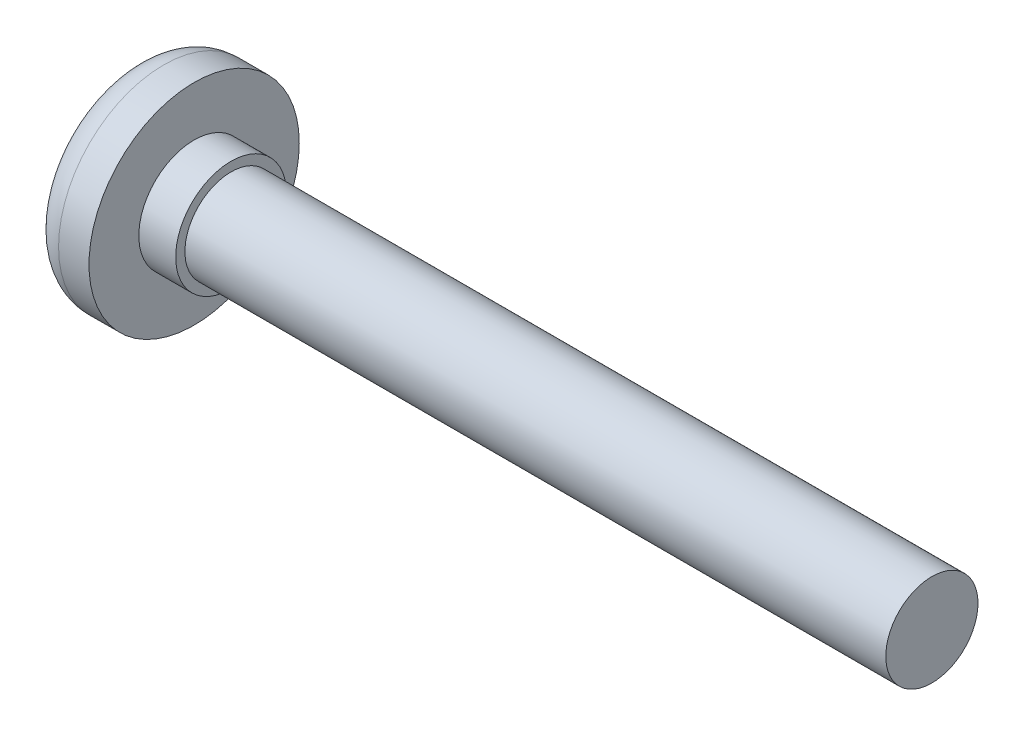
ISO-10303-21;
HEADER;
FILE_DESCRIPTION(('STEP AP214'),'2;1');
FILE_NAME('part.step','',(''),(''),'','','');
FILE_SCHEMA(('AUTOMOTIVE_DESIGN { 1 0 10303 214 1 1 1 1 }'));
ENDSEC;
DATA;
#1=APPLICATION_CONTEXT('core data for automotive mechanical design processes');
#2=APPLICATION_PROTOCOL_DEFINITION('international standard','automotive_design',2000,#1);
#3=PRODUCT_CONTEXT('',#1,'mechanical');
#4=PRODUCT('Part','Part','',(#3));
#5=PRODUCT_RELATED_PRODUCT_CATEGORY('part','',(#4));
#6=PRODUCT_DEFINITION_FORMATION('','',#4);
#7=PRODUCT_DEFINITION_CONTEXT('part definition',#1,'design');
#8=PRODUCT_DEFINITION('design','',#6,#7);
#9=PRODUCT_DEFINITION_SHAPE('','',#8);
#10=(LENGTH_UNIT() NAMED_UNIT(*) SI_UNIT(.MILLI.,.METRE.));
#11=(NAMED_UNIT(*) PLANE_ANGLE_UNIT() SI_UNIT($,.RADIAN.));
#12=(NAMED_UNIT(*) SI_UNIT($,.STERADIAN.) SOLID_ANGLE_UNIT());
#13=UNCERTAINTY_MEASURE_WITH_UNIT(LENGTH_MEASURE(1.E-05),#10,'distance_accuracy_value','');
#14=(GEOMETRIC_REPRESENTATION_CONTEXT(3) GLOBAL_UNCERTAINTY_ASSIGNED_CONTEXT((#13)) GLOBAL_UNIT_ASSIGNED_CONTEXT((#10,
#11,#12)) REPRESENTATION_CONTEXT('',''));
#15=CARTESIAN_POINT('',(0.,0.,0.));
#16=DIRECTION('',(0.,0.,1.));
#17=DIRECTION('',(1.,0.,0.));
#18=AXIS2_PLACEMENT_3D('',#15,#16,#17);
#19=CARTESIAN_POINT('',(22.773389601013,0.,0.));
#20=DIRECTION('',(1.,0.,0.));
#21=DIRECTION('',(0.,0.,-1.));
#22=AXIS2_PLACEMENT_3D('',#19,#20,#21);
#23=CYLINDRICAL_SURFACE('',#22,1.5);
#24=CARTESIAN_POINT('',(-20.,0.,0.));
#25=DIRECTION('',(1.,0.,0.));
#26=DIRECTION('',(0.,0.,-1.));
#27=AXIS2_PLACEMENT_3D('',#24,#25,#26);
#28=CIRCLE('',#27,1.5);
#29=CARTESIAN_POINT('',(-20.,0.,-1.5));
#30=VERTEX_POINT('',#29);
#31=EDGE_CURVE('E243',#30,#30,#28,.T.);
#32=ORIENTED_EDGE('',*,*,#31,.T.);
#33=EDGE_LOOP('',(#32));
#34=FACE_BOUND('',#33,.T.);
#35=CARTESIAN_POINT('',(-19.,0.,0.));
#36=DIRECTION('',(1.,0.,0.));
#37=DIRECTION('',(0.,0.,-1.));
#38=AXIS2_PLACEMENT_3D('',#35,#36,#37);
#39=CIRCLE('',#38,1.5);
#40=CARTESIAN_POINT('',(-19.,0.,-1.5));
#41=VERTEX_POINT('',#40);
#42=EDGE_CURVE('E41',#41,#41,#39,.F.);
#43=ORIENTED_EDGE('',*,*,#42,.T.);
#44=EDGE_LOOP('',(#43));
#45=FACE_BOUND('',#44,.T.);
#46=ADVANCED_FACE('F37',(#34,#45),#23,.T.);
#47=CARTESIAN_POINT('',(-21.65,2.84999999999999,0.));
#48=DIRECTION('',(-1.,0.,0.));
#49=DIRECTION('',(0.,0.,1.));
#50=AXIS2_PLACEMENT_3D('',#47,#48,#49);
#51=PLANE('',#50);
#52=CARTESIAN_POINT('',(-21.65,0.,0.));
#53=DIRECTION('',(-1.,0.,0.));
#54=DIRECTION('',(0.,0.,1.));
#55=AXIS2_PLACEMENT_3D('',#52,#53,#54);
#56=CIRCLE('',#55,2.02499999999999);
#57=CARTESIAN_POINT('',(-21.65,0.,2.02499999999999));
#58=VERTEX_POINT('',#57);
#59=EDGE_CURVE('E141',#58,#58,#56,.T.);
#60=ORIENTED_EDGE('',*,*,#59,.T.);
#61=EDGE_LOOP('',(#60));
#62=FACE_BOUND('',#61,.T.);
#63=CARTESIAN_POINT('',(-21.65,-1.78243556529821,0.));
#64=DIRECTION('',(-1.,0.,0.));
#65=DIRECTION('',(0.,0.,1.));
#66=AXIS2_PLACEMENT_3D('',#63,#64,#65);
#67=CIRCLE('',#66,0.9027181176868);
#68=CARTESIAN_POINT('',(-21.65,-0.976391254172471,0.406438886552242));
#69=VERTEX_POINT('',#68);
#70=CARTESIAN_POINT('',(-21.65,-0.976391254172471,-0.406438886552241));
#71=VERTEX_POINT('',#70);
#72=EDGE_CURVE('E236',#69,#71,#67,.T.);
#73=ORIENTED_EDGE('',*,*,#72,.T.);
#74=CARTESIAN_POINT('',(-21.65,-0.830974793647042,-0.479763520801913));
#75=DIRECTION('',(-1.,0.,0.));
#76=DIRECTION('',(0.,0.,1.));
#77=AXIS2_PLACEMENT_3D('',#74,#75,#76);
#78=CIRCLE('',#77,0.162857142857143);
#79=CARTESIAN_POINT('',(-21.65,-0.840182027926339,-0.642360186870187));
#80=VERTEX_POINT('',#79);
#81=EDGE_CURVE('E188',#71,#80,#78,.F.);
#82=ORIENTED_EDGE('',*,*,#81,.T.);
#83=CARTESIAN_POINT('',(-21.65,-0.891217782649108,-1.54363448015713));
#84=DIRECTION('',(-1.,0.,0.));
#85=DIRECTION('',(0.,0.,1.));
#86=AXIS2_PLACEMENT_3D('',#83,#84,#85);
#87=CIRCLE('',#86,0.9027181176868);
#88=CARTESIAN_POINT('',(-21.65,-0.136209226246133,-1.04879907342243));
#89=VERTEX_POINT('',#88);
#90=EDGE_CURVE('E196',#80,#89,#87,.T.);
#91=ORIENTED_EDGE('',*,*,#90,.T.);
#92=CARTESIAN_POINT('',(-21.65,0.,-0.959527041603826));
#93=DIRECTION('',(-1.,0.,0.));
#94=DIRECTION('',(0.,0.,1.));
#95=AXIS2_PLACEMENT_3D('',#92,#93,#94);
#96=CIRCLE('',#95,0.162857142857143);
#97=CARTESIAN_POINT('',(-21.65,0.136209226246132,-1.04879907342243));
#98=VERTEX_POINT('',#97);
#99=EDGE_CURVE('E190',#89,#98,#96,.F.);
#100=ORIENTED_EDGE('',*,*,#99,.T.);
#101=CARTESIAN_POINT('',(-21.65,0.891217782649106,-1.54363448015713));
#102=DIRECTION('',(-1.,0.,0.));
#103=DIRECTION('',(0.,0.,1.));
#104=AXIS2_PLACEMENT_3D('',#101,#102,#103);
#105=CIRCLE('',#104,0.9027181176868);
#106=CARTESIAN_POINT('',(-21.65,0.840182027926339,-0.642360186870188));
#107=VERTEX_POINT('',#106);
#108=EDGE_CURVE('E194',#98,#107,#105,.T.);
#109=ORIENTED_EDGE('',*,*,#108,.T.);
#110=CARTESIAN_POINT('',(-21.65,0.830974793647042,-0.479763520801914));
#111=DIRECTION('',(-1.,0.,0.));
#112=DIRECTION('',(0.,0.,1.));
#113=AXIS2_PLACEMENT_3D('',#110,#111,#112);
#114=CIRCLE('',#113,0.162857142857143);
#115=CARTESIAN_POINT('',(-21.65,0.976391254172471,-0.406438886552242));
#116=VERTEX_POINT('',#115);
#117=EDGE_CURVE('E46',#107,#116,#114,.F.);
#118=ORIENTED_EDGE('',*,*,#117,.T.);
#119=CARTESIAN_POINT('',(-21.65,1.78243556529821,0.));
#120=DIRECTION('',(-1.,0.,0.));
#121=DIRECTION('',(0.,0.,1.));
#122=AXIS2_PLACEMENT_3D('',#119,#120,#121);
#123=CIRCLE('',#122,0.9027181176868);
#124=CARTESIAN_POINT('',(-21.65,0.976391254172471,0.406438886552242));
#125=VERTEX_POINT('',#124);
#126=EDGE_CURVE('E128',#116,#125,#123,.T.);
#127=ORIENTED_EDGE('',*,*,#126,.T.);
#128=CARTESIAN_POINT('',(-21.65,0.830974793647042,0.479763520801913));
#129=DIRECTION('',(-1.,0.,0.));
#130=DIRECTION('',(0.,0.,1.));
#131=AXIS2_PLACEMENT_3D('',#128,#129,#130);
#132=CIRCLE('',#131,0.162857142857143);
#133=CARTESIAN_POINT('',(-21.65,0.840182027926339,0.642360186870188));
#134=VERTEX_POINT('',#133);
#135=EDGE_CURVE('E12',#125,#134,#132,.F.);
#136=ORIENTED_EDGE('',*,*,#135,.T.);
#137=CARTESIAN_POINT('',(-21.65,0.891217782649109,1.54363448015713));
#138=DIRECTION('',(-1.,0.,0.));
#139=DIRECTION('',(0.,0.,1.));
#140=AXIS2_PLACEMENT_3D('',#137,#138,#139);
#141=CIRCLE('',#140,0.902718117686801);
#142=CARTESIAN_POINT('',(-21.65,0.136209226246133,1.04879907342243));
#143=VERTEX_POINT('',#142);
#144=EDGE_CURVE('E127',#134,#143,#141,.T.);
#145=ORIENTED_EDGE('',*,*,#144,.T.);
#146=CARTESIAN_POINT('',(-21.65,0.,0.959527041603827));
#147=DIRECTION('',(-1.,0.,0.));
#148=DIRECTION('',(0.,0.,1.));
#149=AXIS2_PLACEMENT_3D('',#146,#147,#148);
#150=CIRCLE('',#149,0.162857142857143);
#151=CARTESIAN_POINT('',(-21.65,-0.136209226246132,1.04879907342243));
#152=VERTEX_POINT('',#151);
#153=EDGE_CURVE('E184',#143,#152,#150,.F.);
#154=ORIENTED_EDGE('',*,*,#153,.T.);
#155=CARTESIAN_POINT('',(-21.65,-0.891217782649106,1.54363448015713));
#156=DIRECTION('',(-1.,0.,0.));
#157=DIRECTION('',(0.,0.,1.));
#158=AXIS2_PLACEMENT_3D('',#155,#156,#157);
#159=CIRCLE('',#158,0.9027181176868);
#160=CARTESIAN_POINT('',(-21.65,-0.840182027926338,0.642360186870188));
#161=VERTEX_POINT('',#160);
#162=EDGE_CURVE('E137',#152,#161,#159,.T.);
#163=ORIENTED_EDGE('',*,*,#162,.T.);
#164=CARTESIAN_POINT('',(-21.65,-0.830974793647042,0.479763520801914));
#165=DIRECTION('',(-1.,0.,0.));
#166=DIRECTION('',(0.,0.,1.));
#167=AXIS2_PLACEMENT_3D('',#164,#165,#166);
#168=CIRCLE('',#167,0.162857142857143);
#169=EDGE_CURVE('E186',#161,#69,#168,.F.);
#170=ORIENTED_EDGE('',*,*,#169,.T.);
#171=EDGE_LOOP('',(#73,#82,#91,#100,#109,#118,#127,#136,#145,#154,#163,#170));
#172=FACE_BOUND('',#171,.T.);
#173=ADVANCED_FACE('F126',(#62,#172),#51,.T.);
#174=CARTESIAN_POINT('',(-20.,1.5,0.));
#175=DIRECTION('',(1.,0.,0.));
#176=DIRECTION('',(0.,0.,-1.));
#177=AXIS2_PLACEMENT_3D('',#174,#175,#176);
#178=PLANE('',#177);
#179=CARTESIAN_POINT('',(-20.,0.,0.));
#180=DIRECTION('',(1.,0.,0.));
#181=DIRECTION('',(0.,0.,-1.));
#182=AXIS2_PLACEMENT_3D('',#179,#180,#181);
#183=CIRCLE('',#182,2.84999999999999);
#184=CARTESIAN_POINT('',(-20.,0.,-2.84999999999999));
#185=VERTEX_POINT('',#184);
#186=EDGE_CURVE('E233',#185,#185,#183,.T.);
#187=ORIENTED_EDGE('',*,*,#186,.T.);
#188=EDGE_LOOP('',(#187));
#189=FACE_BOUND('',#188,.T.);
#190=ORIENTED_EDGE('',*,*,#31,.F.);
#191=EDGE_LOOP('',(#190));
#192=FACE_BOUND('',#191,.T.);
#193=ADVANCED_FACE('F272',(#189,#192),#178,.T.);
#194=CARTESIAN_POINT('',(22.773389601013,0.,0.));
#195=DIRECTION('',(1.,0.,0.));
#196=DIRECTION('',(0.,0.,-1.));
#197=AXIS2_PLACEMENT_3D('',#194,#195,#196);
#198=CYLINDRICAL_SURFACE('',#197,2.84999999999999);
#199=CARTESIAN_POINT('',(-20.825,0.,0.));
#200=DIRECTION('',(-1.,0.,0.));
#201=DIRECTION('',(0.,0.,1.));
#202=AXIS2_PLACEMENT_3D('',#199,#200,#201);
#203=CIRCLE('',#202,2.84999999999999);
#204=CARTESIAN_POINT('',(-20.825,0.,2.84999999999999));
#205=VERTEX_POINT('',#204);
#206=EDGE_CURVE('E146',#205,#205,#203,.F.);
#207=ORIENTED_EDGE('',*,*,#206,.T.);
#208=EDGE_LOOP('',(#207));
#209=FACE_BOUND('',#208,.T.);
#210=ORIENTED_EDGE('',*,*,#186,.F.);
#211=EDGE_LOOP('',(#210));
#212=FACE_BOUND('',#211,.T.);
#213=ADVANCED_FACE('F248',(#209,#212),#198,.T.);
#214=CARTESIAN_POINT('',(-20.65,0.891217782649106,-1.54363448015713));
#215=DIRECTION('',(-1.,0.,0.));
#216=DIRECTION('',(0.,0.,1.));
#217=AXIS2_PLACEMENT_3D('',#214,#215,#216);
#218=CYLINDRICAL_SURFACE('',#217,0.9027181176868);
#219=ORIENTED_EDGE('',*,*,#108,.F.);
#220=DIRECTION('',(-1.,0.,0.));
#221=VECTOR('',#220,1.);
#222=CARTESIAN_POINT('',(-20.65,0.136209226246132,-1.04879907342243));
#223=LINE('',#222,#221);
#224=CARTESIAN_POINT('',(-20.65,0.136209226246132,-1.04879907342243));
#225=VERTEX_POINT('',#224);
#226=EDGE_CURVE('E178',#98,#225,#223,.F.);
#227=ORIENTED_EDGE('',*,*,#226,.T.);
#228=CARTESIAN_POINT('',(-20.65,0.891217782649106,-1.54363448015713));
#229=DIRECTION('',(-1.,0.,0.));
#230=DIRECTION('',(0.,0.,1.));
#231=AXIS2_PLACEMENT_3D('',#228,#229,#230);
#232=CIRCLE('',#231,0.9027181176868);
#233=CARTESIAN_POINT('',(-20.65,0.840182027926339,-0.642360186870188));
#234=VERTEX_POINT('',#233);
#235=EDGE_CURVE('E215',#225,#234,#232,.T.);
#236=ORIENTED_EDGE('',*,*,#235,.T.);
#237=DIRECTION('',(-1.,0.,0.));
#238=VECTOR('',#237,1.);
#239=CARTESIAN_POINT('',(-20.65,0.840182027926339,-0.642360186870188));
#240=LINE('',#239,#238);
#241=EDGE_CURVE('E175',#234,#107,#240,.T.);
#242=ORIENTED_EDGE('',*,*,#241,.T.);
#243=EDGE_LOOP('',(#219,#227,#236,#242));
#244=FACE_BOUND('',#243,.T.);
#245=ADVANCED_FACE('F201',(#244),#218,.T.);
#246=CARTESIAN_POINT('',(-20.65,1.78243556529821,0.));
#247=DIRECTION('',(-1.,0.,0.));
#248=DIRECTION('',(0.,0.,1.));
#249=AXIS2_PLACEMENT_3D('',#246,#247,#248);
#250=CYLINDRICAL_SURFACE('',#249,0.9027181176868);
#251=ORIENTED_EDGE('',*,*,#126,.F.);
#252=DIRECTION('',(-1.,0.,0.));
#253=VECTOR('',#252,1.);
#254=CARTESIAN_POINT('',(-20.65,0.976391254172471,-0.406438886552242));
#255=LINE('',#254,#253);
#256=CARTESIAN_POINT('',(-20.65,0.976391254172471,-0.406438886552242));
#257=VERTEX_POINT('',#256);
#258=EDGE_CURVE('E182',#116,#257,#255,.F.);
#259=ORIENTED_EDGE('',*,*,#258,.T.);
#260=CARTESIAN_POINT('',(-20.65,1.78243556529821,0.));
#261=DIRECTION('',(-1.,0.,0.));
#262=DIRECTION('',(0.,0.,1.));
#263=AXIS2_PLACEMENT_3D('',#260,#261,#262);
#264=CIRCLE('',#263,0.9027181176868);
#265=CARTESIAN_POINT('',(-20.65,0.976391254172471,0.406438886552242));
#266=VERTEX_POINT('',#265);
#267=EDGE_CURVE('E231',#257,#266,#264,.T.);
#268=ORIENTED_EDGE('',*,*,#267,.T.);
#269=DIRECTION('',(-1.,0.,0.));
#270=VECTOR('',#269,1.);
#271=CARTESIAN_POINT('',(-20.65,0.976391254172471,0.406438886552242));
#272=LINE('',#271,#270);
#273=EDGE_CURVE('E180',#266,#125,#272,.T.);
#274=ORIENTED_EDGE('',*,*,#273,.T.);
#275=EDGE_LOOP('',(#251,#259,#268,#274));
#276=FACE_BOUND('',#275,.T.);
#277=ADVANCED_FACE('F307',(#276),#250,.T.);
#278=CARTESIAN_POINT('',(-20.65,0.891217782649109,1.54363448015713));
#279=DIRECTION('',(-1.,0.,0.));
#280=DIRECTION('',(0.,0.,1.));
#281=AXIS2_PLACEMENT_3D('',#278,#279,#280);
#282=CYLINDRICAL_SURFACE('',#281,0.902718117686801);
#283=CARTESIAN_POINT('',(-20.65,0.891217782649109,1.54363448015713));
#284=DIRECTION('',(-1.,0.,0.));
#285=DIRECTION('',(0.,0.,1.));
#286=AXIS2_PLACEMENT_3D('',#283,#284,#285);
#287=CIRCLE('',#286,0.902718117686801);
#288=CARTESIAN_POINT('',(-20.65,0.840182027926339,0.642360186870188));
#289=VERTEX_POINT('',#288);
#290=CARTESIAN_POINT('',(-20.65,0.136209226246133,1.04879907342243));
#291=VERTEX_POINT('',#290);
#292=EDGE_CURVE('E229',#289,#291,#287,.T.);
#293=ORIENTED_EDGE('',*,*,#292,.T.);
#294=DIRECTION('',(-1.,0.,0.));
#295=VECTOR('',#294,1.);
#296=CARTESIAN_POINT('',(-20.65,0.136209226246133,1.04879907342243));
#297=LINE('',#296,#295);
#298=EDGE_CURVE('E136',#291,#143,#297,.T.);
#299=ORIENTED_EDGE('',*,*,#298,.T.);
#300=ORIENTED_EDGE('',*,*,#144,.F.);
#301=DIRECTION('',(-1.,0.,0.));
#302=VECTOR('',#301,1.);
#303=CARTESIAN_POINT('',(-20.65,0.840182027926339,0.642360186870188));
#304=LINE('',#303,#302);
#305=EDGE_CURVE('E133',#134,#289,#304,.F.);
#306=ORIENTED_EDGE('',*,*,#305,.T.);
#307=EDGE_LOOP('',(#293,#299,#300,#306));
#308=FACE_BOUND('',#307,.T.);
#309=ADVANCED_FACE('F132',(#308),#282,.T.);
#310=CARTESIAN_POINT('',(-20.65,-0.891217782649106,1.54363448015713));
#311=DIRECTION('',(-1.,0.,0.));
#312=DIRECTION('',(0.,0.,1.));
#313=AXIS2_PLACEMENT_3D('',#310,#311,#312);
#314=CYLINDRICAL_SURFACE('',#313,0.9027181176868);
#315=ORIENTED_EDGE('',*,*,#162,.F.);
#316=DIRECTION('',(-1.,0.,0.));
#317=VECTOR('',#316,1.);
#318=CARTESIAN_POINT('',(-20.65,-0.136209226246132,1.04879907342243));
#319=LINE('',#318,#317);
#320=CARTESIAN_POINT('',(-20.65,-0.136209226246132,1.04879907342243));
#321=VERTEX_POINT('',#320);
#322=EDGE_CURVE('E152',#152,#321,#319,.F.);
#323=ORIENTED_EDGE('',*,*,#322,.T.);
#324=CARTESIAN_POINT('',(-20.65,-0.891217782649106,1.54363448015713));
#325=DIRECTION('',(-1.,0.,0.));
#326=DIRECTION('',(0.,0.,1.));
#327=AXIS2_PLACEMENT_3D('',#324,#325,#326);
#328=CIRCLE('',#327,0.9027181176868);
#329=CARTESIAN_POINT('',(-20.65,-0.840182027926338,0.642360186870188));
#330=VERTEX_POINT('',#329);
#331=EDGE_CURVE('E222',#321,#330,#328,.T.);
#332=ORIENTED_EDGE('',*,*,#331,.T.);
#333=DIRECTION('',(-1.,0.,0.));
#334=VECTOR('',#333,1.);
#335=CARTESIAN_POINT('',(-20.65,-0.840182027926338,0.642360186870188));
#336=LINE('',#335,#334);
#337=EDGE_CURVE('E143',#330,#161,#336,.T.);
#338=ORIENTED_EDGE('',*,*,#337,.T.);
#339=EDGE_LOOP('',(#315,#323,#332,#338));
#340=FACE_BOUND('',#339,.T.);
#341=ADVANCED_FACE('F313',(#340),#314,.T.);
#342=CARTESIAN_POINT('',(-20.65,-1.78243556529821,0.));
#343=DIRECTION('',(-1.,0.,0.));
#344=DIRECTION('',(0.,0.,1.));
#345=AXIS2_PLACEMENT_3D('',#342,#343,#344);
#346=CYLINDRICAL_SURFACE('',#345,0.9027181176868);
#347=ORIENTED_EDGE('',*,*,#72,.F.);
#348=DIRECTION('',(-1.,0.,0.));
#349=VECTOR('',#348,1.);
#350=CARTESIAN_POINT('',(-20.65,-0.976391254172471,0.406438886552242));
#351=LINE('',#350,#349);
#352=CARTESIAN_POINT('',(-20.65,-0.976391254172471,0.406438886552242));
#353=VERTEX_POINT('',#352);
#354=EDGE_CURVE('E168',#69,#353,#351,.F.);
#355=ORIENTED_EDGE('',*,*,#354,.T.);
#356=CARTESIAN_POINT('',(-20.65,-1.78243556529821,0.));
#357=DIRECTION('',(-1.,0.,0.));
#358=DIRECTION('',(0.,0.,1.));
#359=AXIS2_PLACEMENT_3D('',#356,#357,#358);
#360=CIRCLE('',#359,0.9027181176868);
#361=CARTESIAN_POINT('',(-20.65,-0.976391254172471,-0.406438886552241));
#362=VERTEX_POINT('',#361);
#363=EDGE_CURVE('E219',#353,#362,#360,.T.);
#364=ORIENTED_EDGE('',*,*,#363,.T.);
#365=DIRECTION('',(-1.,0.,0.));
#366=VECTOR('',#365,1.);
#367=CARTESIAN_POINT('',(-20.65,-0.976391254172471,-0.406438886552241));
#368=LINE('',#367,#366);
#369=EDGE_CURVE('E165',#362,#71,#368,.T.);
#370=ORIENTED_EDGE('',*,*,#369,.T.);
#371=EDGE_LOOP('',(#347,#355,#364,#370));
#372=FACE_BOUND('',#371,.T.);
#373=ADVANCED_FACE('F316',(#372),#346,.T.);
#374=CARTESIAN_POINT('',(-20.65,-0.891217782649108,-1.54363448015713));
#375=DIRECTION('',(-1.,0.,0.));
#376=DIRECTION('',(0.,0.,1.));
#377=AXIS2_PLACEMENT_3D('',#374,#375,#376);
#378=CYLINDRICAL_SURFACE('',#377,0.9027181176868);
#379=ORIENTED_EDGE('',*,*,#90,.F.);
#380=DIRECTION('',(-1.,0.,0.));
#381=VECTOR('',#380,1.);
#382=CARTESIAN_POINT('',(-20.65,-0.840182027926339,-0.642360186870187));
#383=LINE('',#382,#381);
#384=CARTESIAN_POINT('',(-20.65,-0.840182027926339,-0.642360186870187));
#385=VERTEX_POINT('',#384);
#386=EDGE_CURVE('E173',#80,#385,#383,.F.);
#387=ORIENTED_EDGE('',*,*,#386,.T.);
#388=CARTESIAN_POINT('',(-20.65,-0.891217782649108,-1.54363448015713));
#389=DIRECTION('',(-1.,0.,0.));
#390=DIRECTION('',(0.,0.,1.));
#391=AXIS2_PLACEMENT_3D('',#388,#389,#390);
#392=CIRCLE('',#391,0.9027181176868);
#393=CARTESIAN_POINT('',(-20.65,-0.136209226246133,-1.04879907342243));
#394=VERTEX_POINT('',#393);
#395=EDGE_CURVE('E213',#385,#394,#392,.T.);
#396=ORIENTED_EDGE('',*,*,#395,.T.);
#397=DIRECTION('',(-1.,0.,0.));
#398=VECTOR('',#397,1.);
#399=CARTESIAN_POINT('',(-20.65,-0.136209226246133,-1.04879907342243));
#400=LINE('',#399,#398);
#401=EDGE_CURVE('E170',#394,#89,#400,.T.);
#402=ORIENTED_EDGE('',*,*,#401,.T.);
#403=EDGE_LOOP('',(#379,#387,#396,#402));
#404=FACE_BOUND('',#403,.T.);
#405=ADVANCED_FACE('F217',(#404),#378,.T.);
#406=CARTESIAN_POINT('',(-20.65,0.,0.));
#407=DIRECTION('',(-1.,0.,0.));
#408=DIRECTION('',(0.,0.,1.));
#409=AXIS2_PLACEMENT_3D('',#406,#407,#408);
#410=PLANE('',#409);
#411=ORIENTED_EDGE('',*,*,#331,.F.);
#412=CARTESIAN_POINT('',(-20.65,0.,0.959527041603827));
#413=DIRECTION('',(-1.,0.,0.));
#414=DIRECTION('',(0.,0.,1.));
#415=AXIS2_PLACEMENT_3D('',#412,#413,#414);
#416=CIRCLE('',#415,0.162857142857143);
#417=EDGE_CURVE('E163',#321,#291,#416,.T.);
#418=ORIENTED_EDGE('',*,*,#417,.T.);
#419=ORIENTED_EDGE('',*,*,#292,.F.);
#420=CARTESIAN_POINT('',(-20.65,0.830974793647042,0.479763520801913));
#421=DIRECTION('',(-1.,0.,0.));
#422=DIRECTION('',(0.,0.,1.));
#423=AXIS2_PLACEMENT_3D('',#420,#421,#422);
#424=CIRCLE('',#423,0.162857142857143);
#425=EDGE_CURVE('E140',#289,#266,#424,.T.);
#426=ORIENTED_EDGE('',*,*,#425,.T.);
#427=ORIENTED_EDGE('',*,*,#267,.F.);
#428=CARTESIAN_POINT('',(-20.65,0.830974793647042,-0.479763520801914));
#429=DIRECTION('',(-1.,0.,0.));
#430=DIRECTION('',(0.,0.,1.));
#431=AXIS2_PLACEMENT_3D('',#428,#429,#430);
#432=CIRCLE('',#431,0.162857142857143);
#433=EDGE_CURVE('E155',#257,#234,#432,.T.);
#434=ORIENTED_EDGE('',*,*,#433,.T.);
#435=ORIENTED_EDGE('',*,*,#235,.F.);
#436=CARTESIAN_POINT('',(-20.65,0.,-0.959527041603826));
#437=DIRECTION('',(-1.,0.,0.));
#438=DIRECTION('',(0.,0.,1.));
#439=AXIS2_PLACEMENT_3D('',#436,#437,#438);
#440=CIRCLE('',#439,0.162857142857143);
#441=EDGE_CURVE('E157',#225,#394,#440,.T.);
#442=ORIENTED_EDGE('',*,*,#441,.T.);
#443=ORIENTED_EDGE('',*,*,#395,.F.);
#444=CARTESIAN_POINT('',(-20.65,-0.830974793647042,-0.479763520801913));
#445=DIRECTION('',(-1.,0.,0.));
#446=DIRECTION('',(0.,0.,1.));
#447=AXIS2_PLACEMENT_3D('',#444,#445,#446);
#448=CIRCLE('',#447,0.162857142857143);
#449=EDGE_CURVE('E159',#385,#362,#448,.T.);
#450=ORIENTED_EDGE('',*,*,#449,.T.);
#451=ORIENTED_EDGE('',*,*,#363,.F.);
#452=CARTESIAN_POINT('',(-20.65,-0.830974793647042,0.479763520801914));
#453=DIRECTION('',(-1.,0.,0.));
#454=DIRECTION('',(0.,0.,1.));
#455=AXIS2_PLACEMENT_3D('',#452,#453,#454);
#456=CIRCLE('',#455,0.162857142857143);
#457=EDGE_CURVE('E161',#353,#330,#456,.T.);
#458=ORIENTED_EDGE('',*,*,#457,.T.);
#459=EDGE_LOOP('',(#411,#418,#419,#426,#427,#434,#435,#442,#443,#450,#451,#458));
#460=FACE_BOUND('',#459,.T.);
#461=ADVANCED_FACE('F212',(#460),#410,.T.);
#462=CARTESIAN_POINT('',(-20.825,0.,0.));
#463=DIRECTION('',(-1.,0.,0.));
#464=DIRECTION('',(0.,0.,1.));
#465=AXIS2_PLACEMENT_3D('',#462,#463,#464);
#466=TOROIDAL_SURFACE('',#465,2.02499999999999,0.825);
#467=ORIENTED_EDGE('',*,*,#59,.F.);
#468=EDGE_LOOP('',(#467));
#469=FACE_BOUND('',#468,.T.);
#470=ORIENTED_EDGE('',*,*,#206,.F.);
#471=EDGE_LOOP('',(#470));
#472=FACE_BOUND('',#471,.T.);
#473=ADVANCED_FACE('F251',(#469,#472),#466,.T.);
#474=CARTESIAN_POINT('',(-20.65,0.,0.959527041603827));
#475=DIRECTION('',(1.,0.,0.));
#476=DIRECTION('',(0.,0.,-1.));
#477=AXIS2_PLACEMENT_3D('',#474,#475,#476);
#478=CYLINDRICAL_SURFACE('',#477,0.162857142857143);
#479=ORIENTED_EDGE('',*,*,#417,.F.);
#480=ORIENTED_EDGE('',*,*,#322,.F.);
#481=ORIENTED_EDGE('',*,*,#153,.F.);
#482=ORIENTED_EDGE('',*,*,#298,.F.);
#483=EDGE_LOOP('',(#479,#480,#481,#482));
#484=FACE_BOUND('',#483,.T.);
#485=ADVANCED_FACE('F253',(#484),#478,.F.);
#486=CARTESIAN_POINT('',(-20.65,-0.830974793647042,0.479763520801914));
#487=DIRECTION('',(1.,0.,0.));
#488=DIRECTION('',(0.,0.,-1.));
#489=AXIS2_PLACEMENT_3D('',#486,#487,#488);
#490=CYLINDRICAL_SURFACE('',#489,0.162857142857143);
#491=ORIENTED_EDGE('',*,*,#457,.F.);
#492=ORIENTED_EDGE('',*,*,#354,.F.);
#493=ORIENTED_EDGE('',*,*,#169,.F.);
#494=ORIENTED_EDGE('',*,*,#337,.F.);
#495=EDGE_LOOP('',(#491,#492,#493,#494));
#496=FACE_BOUND('',#495,.T.);
#497=ADVANCED_FACE('F260',(#496),#490,.F.);
#498=CARTESIAN_POINT('',(-20.65,-0.830974793647042,-0.479763520801913));
#499=DIRECTION('',(1.,0.,0.));
#500=DIRECTION('',(0.,0.,-1.));
#501=AXIS2_PLACEMENT_3D('',#498,#499,#500);
#502=CYLINDRICAL_SURFACE('',#501,0.162857142857143);
#503=ORIENTED_EDGE('',*,*,#449,.F.);
#504=ORIENTED_EDGE('',*,*,#386,.F.);
#505=ORIENTED_EDGE('',*,*,#81,.F.);
#506=ORIENTED_EDGE('',*,*,#369,.F.);
#507=EDGE_LOOP('',(#503,#504,#505,#506));
#508=FACE_BOUND('',#507,.T.);
#509=ADVANCED_FACE('F398',(#508),#502,.F.);
#510=CARTESIAN_POINT('',(-20.65,0.,-0.959527041603826));
#511=DIRECTION('',(1.,0.,0.));
#512=DIRECTION('',(0.,0.,-1.));
#513=AXIS2_PLACEMENT_3D('',#510,#511,#512);
#514=CYLINDRICAL_SURFACE('',#513,0.162857142857143);
#515=ORIENTED_EDGE('',*,*,#441,.F.);
#516=ORIENTED_EDGE('',*,*,#226,.F.);
#517=ORIENTED_EDGE('',*,*,#99,.F.);
#518=ORIENTED_EDGE('',*,*,#401,.F.);
#519=EDGE_LOOP('',(#515,#516,#517,#518));
#520=FACE_BOUND('',#519,.T.);
#521=ADVANCED_FACE('F207',(#520),#514,.F.);
#522=CARTESIAN_POINT('',(-20.65,0.830974793647042,-0.479763520801914));
#523=DIRECTION('',(1.,0.,0.));
#524=DIRECTION('',(0.,0.,-1.));
#525=AXIS2_PLACEMENT_3D('',#522,#523,#524);
#526=CYLINDRICAL_SURFACE('',#525,0.162857142857143);
#527=ORIENTED_EDGE('',*,*,#433,.F.);
#528=ORIENTED_EDGE('',*,*,#258,.F.);
#529=ORIENTED_EDGE('',*,*,#117,.F.);
#530=ORIENTED_EDGE('',*,*,#241,.F.);
#531=EDGE_LOOP('',(#527,#528,#529,#530));
#532=FACE_BOUND('',#531,.T.);
#533=ADVANCED_FACE('F305',(#532),#526,.F.);
#534=CARTESIAN_POINT('',(-20.65,0.830974793647042,0.479763520801913));
#535=DIRECTION('',(1.,0.,0.));
#536=DIRECTION('',(0.,0.,-1.));
#537=AXIS2_PLACEMENT_3D('',#534,#535,#536);
#538=CYLINDRICAL_SURFACE('',#537,0.162857142857143);
#539=ORIENTED_EDGE('',*,*,#425,.F.);
#540=ORIENTED_EDGE('',*,*,#305,.F.);
#541=ORIENTED_EDGE('',*,*,#135,.F.);
#542=ORIENTED_EDGE('',*,*,#273,.F.);
#543=EDGE_LOOP('',(#539,#540,#541,#542));
#544=FACE_BOUND('',#543,.T.);
#545=ADVANCED_FACE('F39',(#544),#538,.F.);
#546=CARTESIAN_POINT('',(-19.,0.,0.));
#547=DIRECTION('',(1.,0.,0.));
#548=DIRECTION('',(0.,0.,-1.));
#549=AXIS2_PLACEMENT_3D('',#546,#547,#548);
#550=PLANE('',#549);
#551=ORIENTED_EDGE('',*,*,#42,.F.);
#552=EDGE_LOOP('',(#551));
#553=FACE_BOUND('',#552,.T.);
#554=CARTESIAN_POINT('',(-19.,0.,0.));
#555=DIRECTION('',(1.,0.,0.));
#556=DIRECTION('',(0.,0.,-1.));
#557=AXIS2_PLACEMENT_3D('',#554,#555,#556);
#558=CIRCLE('',#557,1.25);
#559=CARTESIAN_POINT('',(-19.,0.,-1.25));
#560=VERTEX_POINT('',#559);
#561=EDGE_CURVE('E292',#560,#560,#558,.T.);
#562=ORIENTED_EDGE('',*,*,#561,.F.);
#563=EDGE_LOOP('',(#562));
#564=FACE_BOUND('',#563,.T.);
#565=ADVANCED_FACE('F285',(#553,#564),#550,.T.);
#566=CARTESIAN_POINT('',(-19.,0.,0.));
#567=DIRECTION('',(1.,0.,0.));
#568=DIRECTION('',(0.,0.,-1.));
#569=AXIS2_PLACEMENT_3D('',#566,#567,#568);
#570=CYLINDRICAL_SURFACE('',#569,1.25);
#571=ORIENTED_EDGE('',*,*,#561,.T.);
#572=EDGE_LOOP('',(#571));
#573=FACE_BOUND('',#572,.T.);
#574=CARTESIAN_POINT('',(0.,0.,0.));
#575=DIRECTION('',(1.,0.,0.));
#576=DIRECTION('',(0.,0.,-1.));
#577=AXIS2_PLACEMENT_3D('',#574,#575,#576);
#578=CIRCLE('',#577,1.25);
#579=CARTESIAN_POINT('',(0.,0.,-1.25));
#580=VERTEX_POINT('',#579);
#581=EDGE_CURVE('E290',#580,#580,#578,.T.);
#582=ORIENTED_EDGE('',*,*,#581,.F.);
#583=EDGE_LOOP('',(#582));
#584=FACE_BOUND('',#583,.T.);
#585=ADVANCED_FACE('F280',(#573,#584),#570,.T.);
#586=CARTESIAN_POINT('',(0.,0.,0.));
#587=DIRECTION('',(1.,0.,0.));
#588=DIRECTION('',(0.,0.,-1.));
#589=AXIS2_PLACEMENT_3D('',#586,#587,#588);
#590=PLANE('',#589);
#591=ORIENTED_EDGE('',*,*,#581,.T.);
#592=EDGE_LOOP('',(#591));
#593=FACE_BOUND('',#592,.T.);
#594=ADVANCED_FACE('F278',(#593),#590,.T.);
#595=CLOSED_SHELL('',(#46,#173,#193,#213,#245,#277,#309,#341,#373,#405,#461,#473,#485,#497,#509,
#521,#533,#545,#565,#585,#594));
#596=MANIFOLD_SOLID_BREP('B2',#595);
#597=ADVANCED_BREP_SHAPE_REPRESENTATION('',(#18,#596),#14);
#598=SHAPE_DEFINITION_REPRESENTATION(#9,#597);
ENDSEC;
END-ISO-10303-21;
